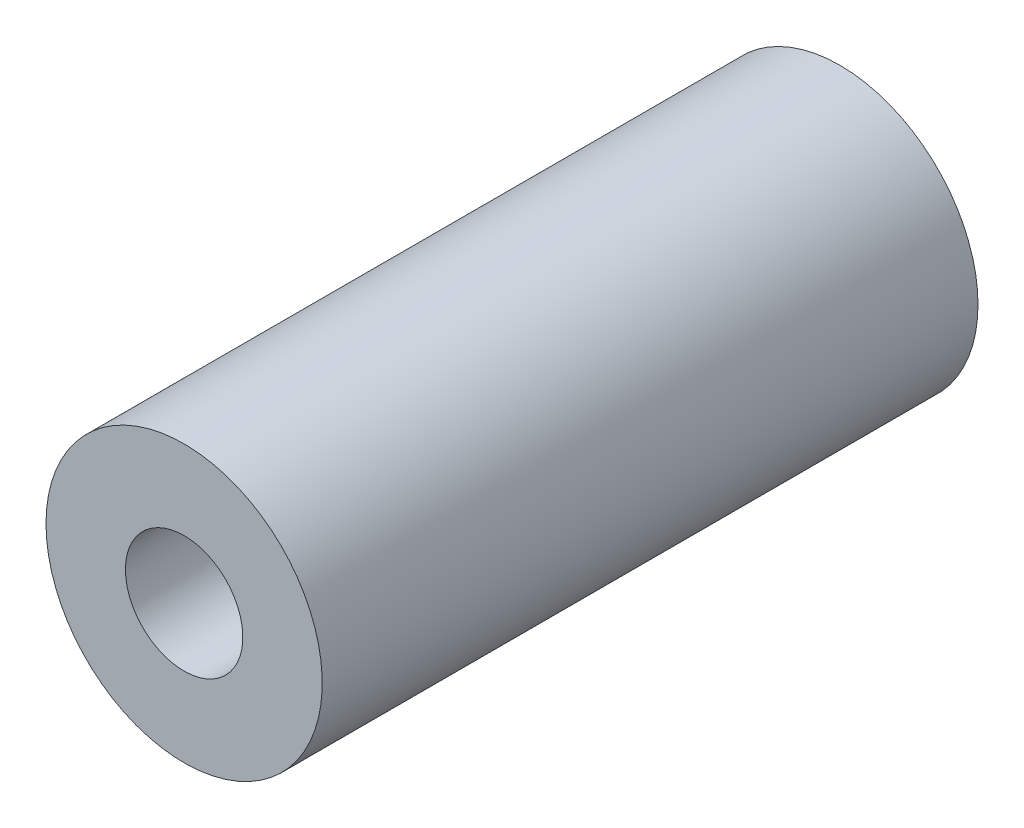
ISO-10303-21;
HEADER;
FILE_DESCRIPTION(('STEP AP214'),'2;1');
FILE_NAME('part.step','',(''),(''),'','','');
FILE_SCHEMA(('AUTOMOTIVE_DESIGN { 1 0 10303 214 1 1 1 1 }'));
ENDSEC;
DATA;
#1=APPLICATION_CONTEXT('core data for automotive mechanical design processes');
#2=APPLICATION_PROTOCOL_DEFINITION('international standard','automotive_design',2000,#1);
#3=PRODUCT_CONTEXT('',#1,'mechanical');
#4=PRODUCT('Part','Part','',(#3));
#5=PRODUCT_RELATED_PRODUCT_CATEGORY('part','',(#4));
#6=PRODUCT_DEFINITION_FORMATION('','',#4);
#7=PRODUCT_DEFINITION_CONTEXT('part definition',#1,'design');
#8=PRODUCT_DEFINITION('design','',#6,#7);
#9=PRODUCT_DEFINITION_SHAPE('','',#8);
#10=(LENGTH_UNIT() NAMED_UNIT(*) SI_UNIT(.MILLI.,.METRE.));
#11=(NAMED_UNIT(*) PLANE_ANGLE_UNIT() SI_UNIT($,.RADIAN.));
#12=(NAMED_UNIT(*) SI_UNIT($,.STERADIAN.) SOLID_ANGLE_UNIT());
#13=UNCERTAINTY_MEASURE_WITH_UNIT(LENGTH_MEASURE(1.E-05),#10,'distance_accuracy_value','');
#14=(GEOMETRIC_REPRESENTATION_CONTEXT(3) GLOBAL_UNCERTAINTY_ASSIGNED_CONTEXT((#13)) GLOBAL_UNIT_ASSIGNED_CONTEXT((#10,
#11,#12)) REPRESENTATION_CONTEXT('',''));
#15=CARTESIAN_POINT('',(0.,0.,0.));
#16=DIRECTION('',(0.,0.,1.));
#17=DIRECTION('',(1.,0.,0.));
#18=AXIS2_PLACEMENT_3D('',#15,#16,#17);
#19=CARTESIAN_POINT('',(0.,0.,0.));
#20=DIRECTION('',(0.,0.,1.));
#21=DIRECTION('',(1.,0.,0.));
#22=AXIS2_PLACEMENT_3D('',#19,#20,#21);
#23=PLANE('',#22);
#24=CARTESIAN_POINT('',(0.,0.,0.));
#25=DIRECTION('',(0.,0.,1.));
#26=DIRECTION('',(1.,0.,0.));
#27=AXIS2_PLACEMENT_3D('',#24,#25,#26);
#28=CIRCLE('',#27,2.);
#29=CARTESIAN_POINT('',(2.,0.,0.));
#30=VERTEX_POINT('',#29);
#31=EDGE_CURVE('E41',#30,#30,#28,.T.);
#32=ORIENTED_EDGE('',*,*,#31,.F.);
#33=EDGE_LOOP('',(#32));
#34=FACE_BOUND('',#33,.T.);
#35=CARTESIAN_POINT('',(0.,0.,0.));
#36=DIRECTION('',(0.,0.,1.));
#37=DIRECTION('',(1.,0.,0.));
#38=AXIS2_PLACEMENT_3D('',#35,#36,#37);
#39=CIRCLE('',#38,0.85);
#40=CARTESIAN_POINT('',(0.85,0.,0.));
#41=VERTEX_POINT('',#40);
#42=EDGE_CURVE('E50',#41,#41,#39,.T.);
#43=ORIENTED_EDGE('',*,*,#42,.T.);
#44=EDGE_LOOP('',(#43));
#45=FACE_BOUND('',#44,.T.);
#46=ADVANCED_FACE('F34',(#34,#45),#23,.F.);
#47=CARTESIAN_POINT('',(0.,0.,15.1528482209739));
#48=DIRECTION('',(0.,0.,-1.));
#49=DIRECTION('',(-1.,0.,0.));
#50=AXIS2_PLACEMENT_3D('',#47,#48,#49);
#51=CYLINDRICAL_SURFACE('',#50,2.);
#52=CARTESIAN_POINT('',(0.,0.,9.49599397148149));
#53=DIRECTION('',(0.,0.,-1.));
#54=DIRECTION('',(-1.,0.,0.));
#55=AXIS2_PLACEMENT_3D('',#52,#53,#54);
#56=CIRCLE('',#55,2.);
#57=CARTESIAN_POINT('',(-2.,0.,9.49599397148148));
#58=VERTEX_POINT('',#57);
#59=EDGE_CURVE('E45',#58,#58,#56,.T.);
#60=ORIENTED_EDGE('',*,*,#59,.T.);
#61=EDGE_LOOP('',(#60));
#62=FACE_BOUND('',#61,.T.);
#63=ORIENTED_EDGE('',*,*,#31,.T.);
#64=EDGE_LOOP('',(#63));
#65=FACE_BOUND('',#64,.T.);
#66=ADVANCED_FACE('F58',(#62,#65),#51,.T.);
#67=CARTESIAN_POINT('',(0.,0.,15.1528482209739));
#68=DIRECTION('',(0.,0.,-1.));
#69=DIRECTION('',(-1.,0.,0.));
#70=AXIS2_PLACEMENT_3D('',#67,#68,#69);
#71=CYLINDRICAL_SURFACE('',#70,0.85);
#72=CARTESIAN_POINT('',(0.,0.,9.49599397148149));
#73=DIRECTION('',(0.,0.,-1.));
#74=DIRECTION('',(-1.,0.,0.));
#75=AXIS2_PLACEMENT_3D('',#72,#73,#74);
#76=CIRCLE('',#75,0.85);
#77=CARTESIAN_POINT('',(-0.85,0.,9.49599397148149));
#78=VERTEX_POINT('',#77);
#79=EDGE_CURVE('E10',#78,#78,#76,.T.);
#80=ORIENTED_EDGE('',*,*,#79,.F.);
#81=EDGE_LOOP('',(#80));
#82=FACE_BOUND('',#81,.T.);
#83=ORIENTED_EDGE('',*,*,#42,.F.);
#84=EDGE_LOOP('',(#83));
#85=FACE_BOUND('',#84,.T.);
#86=ADVANCED_FACE('F56',(#82,#85),#71,.F.);
#87=CARTESIAN_POINT('',(43.3919690477852,76.8046685871302,9.49599397148145));
#88=DIRECTION('',(0.,0.,-1.));
#89=DIRECTION('',(-0.566815825617568,-0.823844536201749,0.));
#90=AXIS2_PLACEMENT_3D('',#87,#88,#89);
#91=PLANE('',#90);
#92=ORIENTED_EDGE('',*,*,#79,.T.);
#93=EDGE_LOOP('',(#92));
#94=FACE_BOUND('',#93,.T.);
#95=ORIENTED_EDGE('',*,*,#59,.F.);
#96=EDGE_LOOP('',(#95));
#97=FACE_BOUND('',#96,.T.);
#98=ADVANCED_FACE('F36',(#94,#97),#91,.F.);
#99=CLOSED_SHELL('',(#46,#66,#86,#98));
#100=MANIFOLD_SOLID_BREP('B2',#99);
#101=ADVANCED_BREP_SHAPE_REPRESENTATION('',(#18,#100),#14);
#102=SHAPE_DEFINITION_REPRESENTATION(#9,#101);
ENDSEC;
END-ISO-10303-21;
